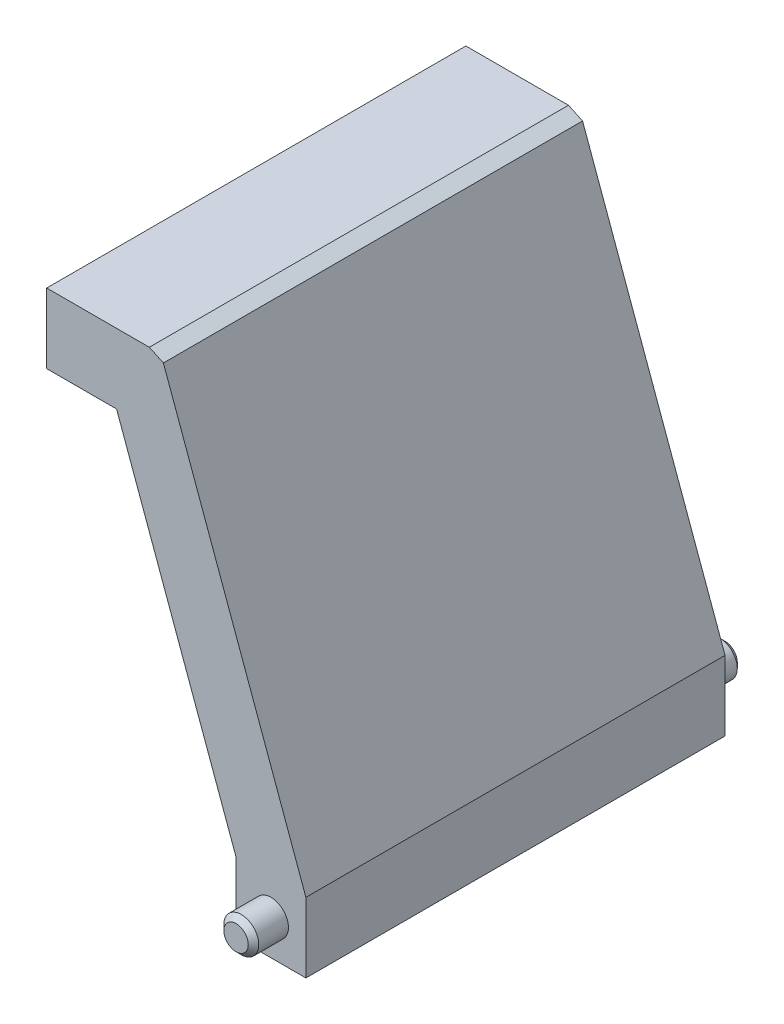
ISO-10303-21;
HEADER;
FILE_DESCRIPTION(('STEP AP214'),'2;1');
FILE_NAME('part.step','',(''),(''),'','','');
FILE_SCHEMA(('AUTOMOTIVE_DESIGN { 1 0 10303 214 1 1 1 1 }'));
ENDSEC;
DATA;
#1=APPLICATION_CONTEXT('core data for automotive mechanical design processes');
#2=APPLICATION_PROTOCOL_DEFINITION('international standard','automotive_design',2000,#1);
#3=PRODUCT_CONTEXT('',#1,'mechanical');
#4=PRODUCT('Part','Part','',(#3));
#5=PRODUCT_RELATED_PRODUCT_CATEGORY('part','',(#4));
#6=PRODUCT_DEFINITION_FORMATION('','',#4);
#7=PRODUCT_DEFINITION_CONTEXT('part definition',#1,'design');
#8=PRODUCT_DEFINITION('design','',#6,#7);
#9=PRODUCT_DEFINITION_SHAPE('','',#8);
#10=(LENGTH_UNIT() NAMED_UNIT(*) SI_UNIT(.MILLI.,.METRE.));
#11=(NAMED_UNIT(*) PLANE_ANGLE_UNIT() SI_UNIT($,.RADIAN.));
#12=(NAMED_UNIT(*) SI_UNIT($,.STERADIAN.) SOLID_ANGLE_UNIT());
#13=UNCERTAINTY_MEASURE_WITH_UNIT(LENGTH_MEASURE(1.E-05),#10,'distance_accuracy_value','');
#14=(GEOMETRIC_REPRESENTATION_CONTEXT(3) GLOBAL_UNCERTAINTY_ASSIGNED_CONTEXT((#13)) GLOBAL_UNIT_ASSIGNED_CONTEXT((#10,
#11,#12)) REPRESENTATION_CONTEXT('',''));
#15=CARTESIAN_POINT('',(0.,0.,0.));
#16=DIRECTION('',(0.,0.,1.));
#17=DIRECTION('',(1.,0.,0.));
#18=AXIS2_PLACEMENT_3D('',#15,#16,#17);
#19=CARTESIAN_POINT('',(-32.1010071662836,0.,60.));
#20=DIRECTION('',(-1.,0.,0.));
#21=DIRECTION('',(0.,0.,1.));
#22=AXIS2_PLACEMENT_3D('',#19,#20,#21);
#23=PLANE('',#22);
#24=DIRECTION('',(0.,1.,0.));
#25=VECTOR('',#24,1.);
#26=CARTESIAN_POINT('',(-32.1010071662836,0.,0.));
#27=LINE('',#26,#25);
#28=CARTESIAN_POINT('',(-32.1010071662836,51.9846310392954,0.));
#29=VERTEX_POINT('',#28);
#30=CARTESIAN_POINT('',(-32.1010071662836,61.9846310392954,0.));
#31=VERTEX_POINT('',#30);
#32=EDGE_CURVE('E131',#29,#31,#27,.T.);
#33=ORIENTED_EDGE('',*,*,#32,.F.);
#34=DIRECTION('',(0.,0.,-1.));
#35=VECTOR('',#34,1.);
#36=CARTESIAN_POINT('',(-32.1010071662836,51.9846310392954,60.));
#37=LINE('',#36,#35);
#38=CARTESIAN_POINT('',(-32.1010071662836,51.9846310392954,60.));
#39=VERTEX_POINT('',#38);
#40=EDGE_CURVE('E126',#39,#29,#37,.T.);
#41=ORIENTED_EDGE('',*,*,#40,.F.);
#42=DIRECTION('',(0.,1.,0.));
#43=VECTOR('',#42,1.);
#44=CARTESIAN_POINT('',(-32.1010071662836,0.,60.));
#45=LINE('',#44,#43);
#46=CARTESIAN_POINT('',(-32.1010071662836,61.9846310392954,60.));
#47=VERTEX_POINT('',#46);
#48=EDGE_CURVE('E129',#39,#47,#45,.T.);
#49=ORIENTED_EDGE('',*,*,#48,.T.);
#50=DIRECTION('',(0.,0.,-1.));
#51=VECTOR('',#50,1.);
#52=CARTESIAN_POINT('',(-32.1010071662836,61.9846310392954,60.));
#53=LINE('',#52,#51);
#54=EDGE_CURVE('E165',#47,#31,#53,.T.);
#55=ORIENTED_EDGE('',*,*,#54,.T.);
#56=EDGE_LOOP('',(#33,#41,#49,#55));
#57=FACE_BOUND('',#56,.T.);
#58=ADVANCED_FACE('F46',(#57),#23,.T.);
#59=CARTESIAN_POINT('',(0.,51.9846310392954,60.));
#60=DIRECTION('',(0.,-1.,0.));
#61=DIRECTION('',(0.,0.,-1.));
#62=AXIS2_PLACEMENT_3D('',#59,#60,#61);
#63=PLANE('',#62);
#64=DIRECTION('',(-1.,0.,0.));
#65=VECTOR('',#64,1.);
#66=CARTESIAN_POINT('',(0.,51.9846310392954,0.));
#67=LINE('',#66,#65);
#68=CARTESIAN_POINT('',(-22.1010071662836,51.9846310392954,0.));
#69=VERTEX_POINT('',#68);
#70=EDGE_CURVE('E167',#69,#29,#67,.T.);
#71=ORIENTED_EDGE('',*,*,#70,.F.);
#72=DIRECTION('',(0.,0.,-1.));
#73=VECTOR('',#72,1.);
#74=CARTESIAN_POINT('',(-22.1010071662836,51.9846310392954,60.));
#75=LINE('',#74,#73);
#76=CARTESIAN_POINT('',(-22.1010071662836,51.9846310392954,60.));
#77=VERTEX_POINT('',#76);
#78=EDGE_CURVE('E137',#77,#69,#75,.T.);
#79=ORIENTED_EDGE('',*,*,#78,.F.);
#80=DIRECTION('',(-1.,0.,0.));
#81=VECTOR('',#80,1.);
#82=CARTESIAN_POINT('',(0.,51.9846310392954,60.));
#83=LINE('',#82,#81);
#84=EDGE_CURVE('E143',#77,#39,#83,.T.);
#85=ORIENTED_EDGE('',*,*,#84,.T.);
#86=ORIENTED_EDGE('',*,*,#40,.T.);
#87=EDGE_LOOP('',(#71,#79,#85,#86));
#88=FACE_BOUND('',#87,.T.);
#89=ADVANCED_FACE('F150',(#88),#63,.T.);
#90=CARTESIAN_POINT('',(-2.80814208358107,-1.0220801320138,60.));
#91=DIRECTION('',(-0.939692620785907,-0.342020143325673,0.));
#92=DIRECTION('',(0.342020143325673,-0.939692620785907,0.));
#93=AXIS2_PLACEMENT_3D('',#90,#91,#92);
#94=PLANE('',#93);
#95=DIRECTION('',(-0.342020143325673,0.939692620785907,0.));
#96=VECTOR('',#95,1.);
#97=CARTESIAN_POINT('',(-2.80814208358107,-1.0220801320138,0.));
#98=LINE('',#97,#96);
#99=CARTESIAN_POINT('',(-5.,5.,0.));
#100=VERTEX_POINT('',#99);
#101=EDGE_CURVE('E170',#100,#69,#98,.T.);
#102=ORIENTED_EDGE('',*,*,#101,.F.);
#103=DIRECTION('',(0.,0.,-1.));
#104=VECTOR('',#103,1.);
#105=CARTESIAN_POINT('',(-5.,5.,60.));
#106=LINE('',#105,#104);
#107=CARTESIAN_POINT('',(-5.,5.,60.));
#108=VERTEX_POINT('',#107);
#109=EDGE_CURVE('E189',#108,#100,#106,.T.);
#110=ORIENTED_EDGE('',*,*,#109,.F.);
#111=DIRECTION('',(-0.342020143325673,0.939692620785907,0.));
#112=VECTOR('',#111,1.);
#113=CARTESIAN_POINT('',(-2.80814208358107,-1.0220801320138,60.));
#114=LINE('',#113,#112);
#115=EDGE_CURVE('E151',#108,#77,#114,.T.);
#116=ORIENTED_EDGE('',*,*,#115,.T.);
#117=ORIENTED_EDGE('',*,*,#78,.T.);
#118=EDGE_LOOP('',(#102,#110,#116,#117));
#119=FACE_BOUND('',#118,.T.);
#120=ADVANCED_FACE('F233',(#119),#94,.T.);
#121=CARTESIAN_POINT('',(-5.,0.,60.));
#122=DIRECTION('',(-1.,0.,0.));
#123=DIRECTION('',(0.,0.,1.));
#124=AXIS2_PLACEMENT_3D('',#121,#122,#123);
#125=PLANE('',#124);
#126=DIRECTION('',(0.,1.,0.));
#127=VECTOR('',#126,1.);
#128=CARTESIAN_POINT('',(-5.,0.,0.));
#129=LINE('',#128,#127);
#130=CARTESIAN_POINT('',(-5.,-1.99999999999998,0.));
#131=VERTEX_POINT('',#130);
#132=EDGE_CURVE('E173',#131,#100,#129,.T.);
#133=ORIENTED_EDGE('',*,*,#132,.F.);
#134=DIRECTION('',(0.,0.,1.));
#135=VECTOR('',#134,1.);
#136=CARTESIAN_POINT('',(-5.,-1.99999999999998,60.));
#137=LINE('',#136,#135);
#138=CARTESIAN_POINT('',(-5.,-1.99999999999998,60.));
#139=VERTEX_POINT('',#138);
#140=EDGE_CURVE('E197',#131,#139,#137,.T.);
#141=ORIENTED_EDGE('',*,*,#140,.T.);
#142=DIRECTION('',(0.,1.,0.));
#143=VECTOR('',#142,1.);
#144=CARTESIAN_POINT('',(-5.,0.,60.));
#145=LINE('',#144,#143);
#146=EDGE_CURVE('E153',#139,#108,#145,.T.);
#147=ORIENTED_EDGE('',*,*,#146,.T.);
#148=ORIENTED_EDGE('',*,*,#109,.T.);
#149=EDGE_LOOP('',(#133,#141,#147,#148));
#150=FACE_BOUND('',#149,.T.);
#151=ADVANCED_FACE('F301',(#150),#125,.T.);
#152=CARTESIAN_POINT('',(0.,-5.,60.));
#153=DIRECTION('',(0.,1.,0.));
#154=DIRECTION('',(0.,0.,1.));
#155=AXIS2_PLACEMENT_3D('',#152,#153,#154);
#156=PLANE('',#155);
#157=DIRECTION('',(1.,0.,0.));
#158=VECTOR('',#157,1.);
#159=CARTESIAN_POINT('',(0.,-5.,60.));
#160=LINE('',#159,#158);
#161=CARTESIAN_POINT('',(-2.,-5.,60.));
#162=VERTEX_POINT('',#161);
#163=CARTESIAN_POINT('',(5.,-5.,60.));
#164=VERTEX_POINT('',#163);
#165=EDGE_CURVE('E158',#162,#164,#160,.T.);
#166=ORIENTED_EDGE('',*,*,#165,.F.);
#167=DIRECTION('',(0.,0.,-1.));
#168=VECTOR('',#167,1.);
#169=CARTESIAN_POINT('',(-2.,-5.,0.));
#170=LINE('',#169,#168);
#171=CARTESIAN_POINT('',(-2.,-5.,0.));
#172=VERTEX_POINT('',#171);
#173=EDGE_CURVE('E136',#162,#172,#170,.T.);
#174=ORIENTED_EDGE('',*,*,#173,.T.);
#175=DIRECTION('',(1.,0.,0.));
#176=VECTOR('',#175,1.);
#177=CARTESIAN_POINT('',(0.,-5.,0.));
#178=LINE('',#177,#176);
#179=CARTESIAN_POINT('',(5.,-5.,0.));
#180=VERTEX_POINT('',#179);
#181=EDGE_CURVE('E175',#172,#180,#178,.T.);
#182=ORIENTED_EDGE('',*,*,#181,.T.);
#183=DIRECTION('',(0.,0.,-1.));
#184=VECTOR('',#183,1.);
#185=CARTESIAN_POINT('',(5.,-5.,60.));
#186=LINE('',#185,#184);
#187=EDGE_CURVE('E186',#164,#180,#186,.T.);
#188=ORIENTED_EDGE('',*,*,#187,.F.);
#189=EDGE_LOOP('',(#166,#174,#182,#188));
#190=FACE_BOUND('',#189,.T.);
#191=ADVANCED_FACE('F280',(#190),#156,.F.);
#192=CARTESIAN_POINT('',(5.,0.,60.));
#193=DIRECTION('',(-1.,0.,0.));
#194=DIRECTION('',(0.,0.,1.));
#195=AXIS2_PLACEMENT_3D('',#192,#193,#194);
#196=PLANE('',#195);
#197=DIRECTION('',(0.,1.,0.));
#198=VECTOR('',#197,1.);
#199=CARTESIAN_POINT('',(5.,0.,0.));
#200=LINE('',#199,#198);
#201=CARTESIAN_POINT('',(5.,5.,0.));
#202=VERTEX_POINT('',#201);
#203=EDGE_CURVE('E177',#180,#202,#200,.T.);
#204=ORIENTED_EDGE('',*,*,#203,.T.);
#205=DIRECTION('',(0.,0.,-1.));
#206=VECTOR('',#205,1.);
#207=CARTESIAN_POINT('',(5.,5.,60.));
#208=LINE('',#207,#206);
#209=CARTESIAN_POINT('',(5.,5.,60.));
#210=VERTEX_POINT('',#209);
#211=EDGE_CURVE('E183',#210,#202,#208,.T.);
#212=ORIENTED_EDGE('',*,*,#211,.F.);
#213=DIRECTION('',(0.,1.,0.));
#214=VECTOR('',#213,1.);
#215=CARTESIAN_POINT('',(5.,0.,60.));
#216=LINE('',#215,#214);
#217=EDGE_CURVE('E160',#164,#210,#216,.T.);
#218=ORIENTED_EDGE('',*,*,#217,.F.);
#219=ORIENTED_EDGE('',*,*,#187,.T.);
#220=EDGE_LOOP('',(#204,#212,#218,#219));
#221=FACE_BOUND('',#220,.T.);
#222=ADVANCED_FACE('F285',(#221),#196,.F.);
#223=CARTESIAN_POINT('',(6.02208013201379,2.19185791641893,60.));
#224=DIRECTION('',(-0.939692620785907,-0.342020143325673,0.));
#225=DIRECTION('',(0.342020143325673,-0.939692620785907,0.));
#226=AXIS2_PLACEMENT_3D('',#223,#224,#225);
#227=PLANE('',#226);
#228=DIRECTION('',(-0.342020143325673,0.939692620785907,0.));
#229=VECTOR('',#228,1.);
#230=CARTESIAN_POINT('',(6.02208013201379,2.19185791641893,0.));
#231=LINE('',#230,#229);
#232=CARTESIAN_POINT('',(-15.39868936562,61.0449384185095,0.));
#233=VERTEX_POINT('',#232);
#234=EDGE_CURVE('E179',#202,#233,#231,.T.);
#235=ORIENTED_EDGE('',*,*,#234,.T.);
#236=DIRECTION('',(0.,0.,1.));
#237=VECTOR('',#236,1.);
#238=CARTESIAN_POINT('',(-15.39868936562,61.0449384185095,60.));
#239=LINE('',#238,#237);
#240=CARTESIAN_POINT('',(-15.39868936562,61.0449384185095,60.));
#241=VERTEX_POINT('',#240);
#242=EDGE_CURVE('E62',#233,#241,#239,.T.);
#243=ORIENTED_EDGE('',*,*,#242,.T.);
#244=DIRECTION('',(-0.342020143325673,0.939692620785907,0.));
#245=VECTOR('',#244,1.);
#246=CARTESIAN_POINT('',(6.02208013201379,2.19185791641893,60.));
#247=LINE('',#246,#245);
#248=EDGE_CURVE('E162',#210,#241,#247,.T.);
#249=ORIENTED_EDGE('',*,*,#248,.F.);
#250=ORIENTED_EDGE('',*,*,#211,.T.);
#251=EDGE_LOOP('',(#235,#243,#249,#250));
#252=FACE_BOUND('',#251,.T.);
#253=ADVANCED_FACE('F287',(#252),#227,.F.);
#254=CARTESIAN_POINT('',(0.,61.9846310392954,60.));
#255=DIRECTION('',(0.,-1.,0.));
#256=DIRECTION('',(0.,0.,-1.));
#257=AXIS2_PLACEMENT_3D('',#254,#255,#256);
#258=PLANE('',#257);
#259=DIRECTION('',(-1.,0.,0.));
#260=VECTOR('',#259,1.);
#261=CARTESIAN_POINT('',(0.,61.9846310392954,60.));
#262=LINE('',#261,#260);
#263=CARTESIAN_POINT('',(-17.4138666940472,61.9846310392954,60.));
#264=VERTEX_POINT('',#263);
#265=EDGE_CURVE('E146',#264,#47,#262,.T.);
#266=ORIENTED_EDGE('',*,*,#265,.F.);
#267=DIRECTION('',(0.,0.,-1.));
#268=VECTOR('',#267,1.);
#269=CARTESIAN_POINT('',(-17.4138666940472,61.9846310392954,60.));
#270=LINE('',#269,#268);
#271=CARTESIAN_POINT('',(-17.4138666940472,61.9846310392954,0.));
#272=VERTEX_POINT('',#271);
#273=EDGE_CURVE('E202',#264,#272,#270,.T.);
#274=ORIENTED_EDGE('',*,*,#273,.T.);
#275=DIRECTION('',(-1.,0.,0.));
#276=VECTOR('',#275,1.);
#277=CARTESIAN_POINT('',(0.,61.9846310392954,0.));
#278=LINE('',#277,#276);
#279=EDGE_CURVE('E148',#272,#31,#278,.T.);
#280=ORIENTED_EDGE('',*,*,#279,.T.);
#281=ORIENTED_EDGE('',*,*,#54,.F.);
#282=EDGE_LOOP('',(#266,#274,#280,#281));
#283=FACE_BOUND('',#282,.T.);
#284=ADVANCED_FACE('F267',(#283),#258,.F.);
#285=CARTESIAN_POINT('',(0.,0.,60.));
#286=DIRECTION('',(0.,0.,1.));
#287=DIRECTION('',(1.,0.,0.));
#288=AXIS2_PLACEMENT_3D('',#285,#286,#287);
#289=PLANE('',#288);
#290=CARTESIAN_POINT('',(0.,0.,60.));
#291=DIRECTION('',(0.,0.,1.));
#292=DIRECTION('',(1.,0.,0.));
#293=AXIS2_PLACEMENT_3D('',#290,#291,#292);
#294=CIRCLE('',#293,2.5);
#295=CARTESIAN_POINT('',(2.5,0.,60.));
#296=VERTEX_POINT('',#295);
#297=EDGE_CURVE('E201',#296,#296,#294,.T.);
#298=ORIENTED_EDGE('',*,*,#297,.F.);
#299=EDGE_LOOP('',(#298));
#300=FACE_BOUND('',#299,.T.);
#301=ORIENTED_EDGE('',*,*,#248,.T.);
#302=DIRECTION('',(0.90630778703665,-0.4226182617407,0.));
#303=VECTOR('',#302,1.);
#304=CARTESIAN_POINT('',(20.6312666100259,44.2438940240783,60.));
#305=LINE('',#304,#303);
#306=EDGE_CURVE('E207',#241,#264,#305,.F.);
#307=ORIENTED_EDGE('',*,*,#306,.T.);
#308=ORIENTED_EDGE('',*,*,#265,.T.);
#309=ORIENTED_EDGE('',*,*,#48,.F.);
#310=ORIENTED_EDGE('',*,*,#84,.F.);
#311=ORIENTED_EDGE('',*,*,#115,.F.);
#312=ORIENTED_EDGE('',*,*,#146,.F.);
#313=DIRECTION('',(0.707106781186546,-0.707106781186549,0.));
#314=VECTOR('',#313,1.);
#315=CARTESIAN_POINT('',(-3.5,-3.49999999999999,60.));
#316=LINE('',#315,#314);
#317=EDGE_CURVE('E199',#139,#162,#316,.T.);
#318=ORIENTED_EDGE('',*,*,#317,.T.);
#319=ORIENTED_EDGE('',*,*,#165,.T.);
#320=ORIENTED_EDGE('',*,*,#217,.T.);
#321=EDGE_LOOP('',(#301,#307,#308,#309,#310,#311,#312,#318,#319,#320));
#322=FACE_BOUND('',#321,.T.);
#323=ADVANCED_FACE('F141',(#300,#322),#289,.T.);
#324=CARTESIAN_POINT('',(0.,0.,0.));
#325=DIRECTION('',(0.,0.,1.));
#326=DIRECTION('',(1.,0.,0.));
#327=AXIS2_PLACEMENT_3D('',#324,#325,#326);
#328=PLANE('',#327);
#329=CARTESIAN_POINT('',(0.,0.,0.));
#330=DIRECTION('',(0.,0.,1.));
#331=DIRECTION('',(1.,0.,0.));
#332=AXIS2_PLACEMENT_3D('',#329,#330,#331);
#333=CIRCLE('',#332,2.5);
#334=CARTESIAN_POINT('',(2.5,0.,0.));
#335=VERTEX_POINT('',#334);
#336=EDGE_CURVE('E168',#335,#335,#333,.T.);
#337=ORIENTED_EDGE('',*,*,#336,.T.);
#338=EDGE_LOOP('',(#337));
#339=FACE_BOUND('',#338,.T.);
#340=ORIENTED_EDGE('',*,*,#279,.F.);
#341=DIRECTION('',(-0.90630778703665,0.4226182617407,0.));
#342=VECTOR('',#341,1.);
#343=CARTESIAN_POINT('',(-17.4138666940472,61.9846310392954,0.));
#344=LINE('',#343,#342);
#345=EDGE_CURVE('E70',#272,#233,#344,.F.);
#346=ORIENTED_EDGE('',*,*,#345,.T.);
#347=ORIENTED_EDGE('',*,*,#234,.F.);
#348=ORIENTED_EDGE('',*,*,#203,.F.);
#349=ORIENTED_EDGE('',*,*,#181,.F.);
#350=DIRECTION('',(-0.707106781186546,0.707106781186549,0.));
#351=VECTOR('',#350,1.);
#352=CARTESIAN_POINT('',(-2.,-5.,0.));
#353=LINE('',#352,#351);
#354=EDGE_CURVE('E195',#172,#131,#353,.T.);
#355=ORIENTED_EDGE('',*,*,#354,.T.);
#356=ORIENTED_EDGE('',*,*,#132,.T.);
#357=ORIENTED_EDGE('',*,*,#101,.T.);
#358=ORIENTED_EDGE('',*,*,#70,.T.);
#359=ORIENTED_EDGE('',*,*,#32,.T.);
#360=EDGE_LOOP('',(#340,#346,#347,#348,#349,#355,#356,#357,#358,#359));
#361=FACE_BOUND('',#360,.T.);
#362=ADVANCED_FACE('F245',(#339,#361),#328,.F.);
#363=CARTESIAN_POINT('',(-2.,-5.,60.));
#364=DIRECTION('',(-0.707106781186549,-0.707106781186546,0.));
#365=DIRECTION('',(0.,0.,1.));
#366=AXIS2_PLACEMENT_3D('',#363,#364,#365);
#367=PLANE('',#366);
#368=ORIENTED_EDGE('',*,*,#317,.F.);
#369=ORIENTED_EDGE('',*,*,#140,.F.);
#370=ORIENTED_EDGE('',*,*,#354,.F.);
#371=ORIENTED_EDGE('',*,*,#173,.F.);
#372=EDGE_LOOP('',(#368,#369,#370,#371));
#373=FACE_BOUND('',#372,.T.);
#374=ADVANCED_FACE('F238',(#373),#367,.T.);
#375=CARTESIAN_POINT('',(0.,0.,65.));
#376=DIRECTION('',(0.,0.,-1.));
#377=DIRECTION('',(-1.,0.,0.));
#378=AXIS2_PLACEMENT_3D('',#375,#376,#377);
#379=CYLINDRICAL_SURFACE('',#378,2.5);
#380=CARTESIAN_POINT('',(0.,0.,64.25));
#381=DIRECTION('',(0.,0.,1.));
#382=DIRECTION('',(1.,0.,0.));
#383=AXIS2_PLACEMENT_3D('',#380,#381,#382);
#384=CIRCLE('',#383,2.5);
#385=CARTESIAN_POINT('',(2.5,0.,64.25));
#386=VERTEX_POINT('',#385);
#387=EDGE_CURVE('E11',#386,#386,#384,.F.);
#388=ORIENTED_EDGE('',*,*,#387,.T.);
#389=EDGE_LOOP('',(#388));
#390=FACE_BOUND('',#389,.T.);
#391=ORIENTED_EDGE('',*,*,#297,.T.);
#392=EDGE_LOOP('',(#391));
#393=FACE_BOUND('',#392,.T.);
#394=ADVANCED_FACE('F244',(#390,#393),#379,.T.);
#395=CARTESIAN_POINT('',(0.,0.,65.));
#396=DIRECTION('',(0.,0.,1.));
#397=DIRECTION('',(1.,0.,0.));
#398=AXIS2_PLACEMENT_3D('',#395,#396,#397);
#399=PLANE('',#398);
#400=CARTESIAN_POINT('',(0.,0.,65.));
#401=DIRECTION('',(0.,0.,1.));
#402=DIRECTION('',(1.,0.,0.));
#403=AXIS2_PLACEMENT_3D('',#400,#401,#402);
#404=CIRCLE('',#403,1.75);
#405=CARTESIAN_POINT('',(1.75,0.,65.));
#406=VERTEX_POINT('',#405);
#407=EDGE_CURVE('E55',#406,#406,#404,.T.);
#408=ORIENTED_EDGE('',*,*,#407,.T.);
#409=EDGE_LOOP('',(#408));
#410=FACE_BOUND('',#409,.T.);
#411=ADVANCED_FACE('F217',(#410),#399,.T.);
#412=CARTESIAN_POINT('',(0.,0.,-5.));
#413=DIRECTION('',(0.,0.,1.));
#414=DIRECTION('',(1.,0.,0.));
#415=AXIS2_PLACEMENT_3D('',#412,#413,#414);
#416=CYLINDRICAL_SURFACE('',#415,2.5);
#417=CARTESIAN_POINT('',(0.,0.,-4.25));
#418=DIRECTION('',(0.,0.,1.));
#419=DIRECTION('',(1.,0.,0.));
#420=AXIS2_PLACEMENT_3D('',#417,#418,#419);
#421=CIRCLE('',#420,2.5);
#422=CARTESIAN_POINT('',(2.5,0.,-4.25));
#423=VERTEX_POINT('',#422);
#424=EDGE_CURVE('E209',#423,#423,#421,.T.);
#425=ORIENTED_EDGE('',*,*,#424,.T.);
#426=EDGE_LOOP('',(#425));
#427=FACE_BOUND('',#426,.T.);
#428=ORIENTED_EDGE('',*,*,#336,.F.);
#429=EDGE_LOOP('',(#428));
#430=FACE_BOUND('',#429,.T.);
#431=ADVANCED_FACE('F261',(#427,#430),#416,.T.);
#432=CARTESIAN_POINT('',(0.,0.,-5.));
#433=DIRECTION('',(0.,0.,1.));
#434=DIRECTION('',(1.,0.,0.));
#435=AXIS2_PLACEMENT_3D('',#432,#433,#434);
#436=PLANE('',#435);
#437=CARTESIAN_POINT('',(0.,0.,-5.));
#438=DIRECTION('',(0.,0.,1.));
#439=DIRECTION('',(1.,0.,0.));
#440=AXIS2_PLACEMENT_3D('',#437,#438,#439);
#441=CIRCLE('',#440,1.74999999999999);
#442=CARTESIAN_POINT('',(1.74999999999999,0.,-5.));
#443=VERTEX_POINT('',#442);
#444=EDGE_CURVE('E212',#443,#443,#441,.F.);
#445=ORIENTED_EDGE('',*,*,#444,.T.);
#446=EDGE_LOOP('',(#445));
#447=FACE_BOUND('',#446,.T.);
#448=ADVANCED_FACE('F251',(#447),#436,.F.);
#449=CARTESIAN_POINT('',(-17.4138666940472,61.9846310392954,60.));
#450=DIRECTION('',(-0.4226182617407,-0.90630778703665,0.));
#451=DIRECTION('',(0.,0.,-1.));
#452=AXIS2_PLACEMENT_3D('',#449,#450,#451);
#453=PLANE('',#452);
#454=ORIENTED_EDGE('',*,*,#306,.F.);
#455=ORIENTED_EDGE('',*,*,#242,.F.);
#456=ORIENTED_EDGE('',*,*,#345,.F.);
#457=ORIENTED_EDGE('',*,*,#273,.F.);
#458=EDGE_LOOP('',(#454,#455,#456,#457));
#459=FACE_BOUND('',#458,.T.);
#460=ADVANCED_FACE('F225',(#459),#453,.F.);
#461=CARTESIAN_POINT('',(0.,0.,-4.25));
#462=DIRECTION('',(0.,0.,1.));
#463=DIRECTION('',(1.,0.,0.));
#464=AXIS2_PLACEMENT_3D('',#461,#462,#463);
#465=CONICAL_SURFACE('',#464,2.5,0.785398163397454);
#466=ORIENTED_EDGE('',*,*,#444,.F.);
#467=EDGE_LOOP('',(#466));
#468=FACE_BOUND('',#467,.T.);
#469=ORIENTED_EDGE('',*,*,#424,.F.);
#470=EDGE_LOOP('',(#469));
#471=FACE_BOUND('',#470,.T.);
#472=ADVANCED_FACE('F220',(#468,#471),#465,.T.);
#473=CARTESIAN_POINT('',(0.,0.,65.));
#474=DIRECTION('',(0.,0.,-1.));
#475=DIRECTION('',(-1.,0.,0.));
#476=AXIS2_PLACEMENT_3D('',#473,#474,#475);
#477=CONICAL_SURFACE('',#476,1.75,0.785398163397456);
#478=ORIENTED_EDGE('',*,*,#387,.F.);
#479=EDGE_LOOP('',(#478));
#480=FACE_BOUND('',#479,.T.);
#481=ORIENTED_EDGE('',*,*,#407,.F.);
#482=EDGE_LOOP('',(#481));
#483=FACE_BOUND('',#482,.T.);
#484=ADVANCED_FACE('F49',(#480,#483),#477,.T.);
#485=CLOSED_SHELL('',(#58,#89,#120,#151,#191,#222,#253,#284,#323,#362,#374,#394,#411,#431,#448,
#460,#472,#484));
#486=MANIFOLD_SOLID_BREP('B2',#485);
#487=ADVANCED_BREP_SHAPE_REPRESENTATION('',(#18,#486),#14);
#488=SHAPE_DEFINITION_REPRESENTATION(#9,#487);
ENDSEC;
END-ISO-10303-21;
